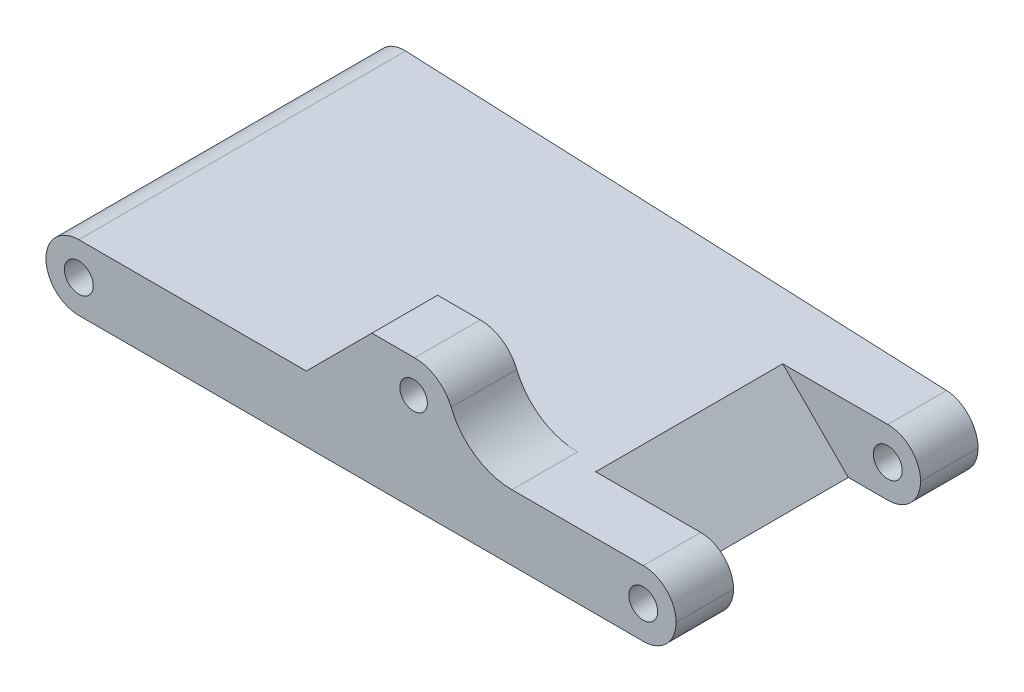
ISO-10303-21;
HEADER;
FILE_DESCRIPTION(('STEP AP214'),'2;1');
FILE_NAME('part.step','',(''),(''),'','','');
FILE_SCHEMA(('AUTOMOTIVE_DESIGN { 1 0 10303 214 1 1 1 1 }'));
ENDSEC;
DATA;
#1=APPLICATION_CONTEXT('core data for automotive mechanical design processes');
#2=APPLICATION_PROTOCOL_DEFINITION('international standard','automotive_design',2000,#1);
#3=PRODUCT_CONTEXT('',#1,'mechanical');
#4=PRODUCT('Part','Part','',(#3));
#5=PRODUCT_RELATED_PRODUCT_CATEGORY('part','',(#4));
#6=PRODUCT_DEFINITION_FORMATION('','',#4);
#7=PRODUCT_DEFINITION_CONTEXT('part definition',#1,'design');
#8=PRODUCT_DEFINITION('design','',#6,#7);
#9=PRODUCT_DEFINITION_SHAPE('','',#8);
#10=(LENGTH_UNIT() NAMED_UNIT(*) SI_UNIT(.MILLI.,.METRE.));
#11=(NAMED_UNIT(*) PLANE_ANGLE_UNIT() SI_UNIT($,.RADIAN.));
#12=(NAMED_UNIT(*) SI_UNIT($,.STERADIAN.) SOLID_ANGLE_UNIT());
#13=UNCERTAINTY_MEASURE_WITH_UNIT(LENGTH_MEASURE(1.E-05),#10,'distance_accuracy_value','');
#14=(GEOMETRIC_REPRESENTATION_CONTEXT(3) GLOBAL_UNCERTAINTY_ASSIGNED_CONTEXT((#13)) GLOBAL_UNIT_ASSIGNED_CONTEXT((#10,
#11,#12)) REPRESENTATION_CONTEXT('',''));
#15=CARTESIAN_POINT('',(0.,0.,0.));
#16=DIRECTION('',(0.,0.,1.));
#17=DIRECTION('',(1.,0.,0.));
#18=AXIS2_PLACEMENT_3D('',#15,#16,#17);
#19=CARTESIAN_POINT('',(17.8860294117647,2.5,-28.0084529624945));
#20=DIRECTION('',(0.,0.,1.));
#21=DIRECTION('',(1.,0.,0.));
#22=AXIS2_PLACEMENT_3D('',#19,#20,#21);
#23=CYLINDRICAL_SURFACE('',#22,1.1);
#24=CARTESIAN_POINT('',(17.8860294117647,2.5,0.));
#25=DIRECTION('',(0.,0.,1.));
#26=DIRECTION('',(1.,0.,0.));
#27=AXIS2_PLACEMENT_3D('',#24,#25,#26);
#28=CIRCLE('',#27,1.1);
#29=CARTESIAN_POINT('',(18.9860294117647,2.5,0.));
#30=VERTEX_POINT('',#29);
#31=EDGE_CURVE('E202',#30,#30,#28,.T.);
#32=ORIENTED_EDGE('',*,*,#31,.T.);
#33=EDGE_LOOP('',(#32));
#34=FACE_BOUND('',#33,.T.);
#35=CARTESIAN_POINT('',(17.8860294117647,2.5,-4.375));
#36=DIRECTION('',(0.,0.,-1.));
#37=DIRECTION('',(-1.,0.,0.));
#38=AXIS2_PLACEMENT_3D('',#35,#36,#37);
#39=CIRCLE('',#38,1.1);
#40=CARTESIAN_POINT('',(16.7860294117647,2.5,-4.375));
#41=VERTEX_POINT('',#40);
#42=EDGE_CURVE('E279',#41,#41,#39,.F.);
#43=ORIENTED_EDGE('',*,*,#42,.F.);
#44=EDGE_LOOP('',(#43));
#45=FACE_BOUND('',#44,.T.);
#46=ADVANCED_FACE('F33',(#34,#45),#23,.F.);
#47=CARTESIAN_POINT('',(17.8860294117647,2.5,0.));
#48=DIRECTION('',(0.,0.,-1.));
#49=DIRECTION('',(-1.,0.,0.));
#50=AXIS2_PLACEMENT_3D('',#47,#48,#49);
#51=CYLINDRICAL_SURFACE('',#50,2.5);
#52=DIRECTION('',(0.,0.,-1.));
#53=VECTOR('',#52,1.);
#54=CARTESIAN_POINT('',(20.3860294117647,2.5,0.));
#55=LINE('',#54,#53);
#56=CARTESIAN_POINT('',(20.3860294117647,2.5,-4.375));
#57=VERTEX_POINT('',#56);
#58=CARTESIAN_POINT('',(20.3860294117647,2.5,0.));
#59=VERTEX_POINT('',#58);
#60=EDGE_CURVE('E197',#57,#59,#55,.F.);
#61=ORIENTED_EDGE('',*,*,#60,.F.);
#62=CARTESIAN_POINT('',(17.8860294117647,2.5,-4.375));
#63=DIRECTION('',(0.,0.,-1.));
#64=DIRECTION('',(-1.,0.,0.));
#65=AXIS2_PLACEMENT_3D('',#62,#63,#64);
#66=CIRCLE('',#65,2.5);
#67=CARTESIAN_POINT('',(17.8860294117647,5.,-4.375));
#68=VERTEX_POINT('',#67);
#69=EDGE_CURVE('E282',#57,#68,#66,.F.);
#70=ORIENTED_EDGE('',*,*,#69,.T.);
#71=DIRECTION('',(0.,0.,-1.));
#72=VECTOR('',#71,1.);
#73=CARTESIAN_POINT('',(17.8860294117647,5.,0.));
#74=LINE('',#73,#72);
#75=CARTESIAN_POINT('',(17.8860294117647,5.,0.));
#76=VERTEX_POINT('',#75);
#77=EDGE_CURVE('E193',#76,#68,#74,.T.);
#78=ORIENTED_EDGE('',*,*,#77,.F.);
#79=CARTESIAN_POINT('',(17.8860294117647,2.5,0.));
#80=DIRECTION('',(0.,0.,-1.));
#81=DIRECTION('',(-1.,0.,0.));
#82=AXIS2_PLACEMENT_3D('',#79,#80,#81);
#83=CIRCLE('',#82,2.5);
#84=EDGE_CURVE('E211',#59,#76,#83,.F.);
#85=ORIENTED_EDGE('',*,*,#84,.F.);
#86=EDGE_LOOP('',(#61,#70,#78,#85));
#87=FACE_BOUND('',#86,.T.);
#88=ADVANCED_FACE('F299',(#87),#51,.T.);
#89=CARTESIAN_POINT('',(17.8860294117647,2.5,0.));
#90=DIRECTION('',(0.,0.,1.));
#91=DIRECTION('',(1.,0.,0.));
#92=AXIS2_PLACEMENT_3D('',#89,#90,#91);
#93=CYLINDRICAL_SURFACE('',#92,2.5);
#94=DIRECTION('',(0.,0.,-1.));
#95=VECTOR('',#94,1.);
#96=CARTESIAN_POINT('',(17.8860294117647,0.,0.));
#97=LINE('',#96,#95);
#98=CARTESIAN_POINT('',(17.8860294117647,0.,-4.375));
#99=VERTEX_POINT('',#98);
#100=CARTESIAN_POINT('',(17.8860294117647,0.,0.));
#101=VERTEX_POINT('',#100);
#102=EDGE_CURVE('E220',#99,#101,#97,.F.);
#103=ORIENTED_EDGE('',*,*,#102,.F.);
#104=CARTESIAN_POINT('',(17.8860294117647,2.5,-4.375));
#105=DIRECTION('',(0.,0.,-1.));
#106=DIRECTION('',(-1.,0.,0.));
#107=AXIS2_PLACEMENT_3D('',#104,#105,#106);
#108=CIRCLE('',#107,2.5);
#109=EDGE_CURVE('E154',#99,#57,#108,.F.);
#110=ORIENTED_EDGE('',*,*,#109,.T.);
#111=ORIENTED_EDGE('',*,*,#60,.T.);
#112=CARTESIAN_POINT('',(17.8860294117647,2.5,0.));
#113=DIRECTION('',(0.,0.,-1.));
#114=DIRECTION('',(-1.,0.,0.));
#115=AXIS2_PLACEMENT_3D('',#112,#113,#114);
#116=CIRCLE('',#115,2.5);
#117=EDGE_CURVE('E208',#101,#59,#116,.F.);
#118=ORIENTED_EDGE('',*,*,#117,.F.);
#119=EDGE_LOOP('',(#103,#110,#111,#118));
#120=FACE_BOUND('',#119,.T.);
#121=ADVANCED_FACE('F303',(#120),#93,.T.);
#122=CARTESIAN_POINT('',(0.,5.,0.));
#123=DIRECTION('',(0.,-1.,0.));
#124=DIRECTION('',(0.,0.,-1.));
#125=AXIS2_PLACEMENT_3D('',#122,#123,#124);
#126=PLANE('',#125);
#127=DIRECTION('',(0.,0.,-1.));
#128=VECTOR('',#127,1.);
#129=CARTESIAN_POINT('',(9.8860294117647,5.,-18.625));
#130=LINE('',#129,#128);
#131=CARTESIAN_POINT('',(9.8860294117647,5.,-4.375));
#132=VERTEX_POINT('',#131);
#133=CARTESIAN_POINT('',(9.8860294117647,5.,-18.625));
#134=VERTEX_POINT('',#133);
#135=EDGE_CURVE('E170',#132,#134,#130,.T.);
#136=ORIENTED_EDGE('',*,*,#135,.T.);
#137=DIRECTION('',(-1.,0.,0.));
#138=VECTOR('',#137,1.);
#139=CARTESIAN_POINT('',(20.3860294117647,5.,-18.625));
#140=LINE('',#139,#138);
#141=CARTESIAN_POINT('',(17.8860294117647,5.,-18.625));
#142=VERTEX_POINT('',#141);
#143=EDGE_CURVE('E166',#142,#134,#140,.T.);
#144=ORIENTED_EDGE('',*,*,#143,.F.);
#145=CARTESIAN_POINT('',(17.8860294117647,5.,-23.1041666666667));
#146=VERTEX_POINT('',#145);
#147=EDGE_CURVE('E205',#142,#146,#74,.T.);
#148=ORIENTED_EDGE('',*,*,#147,.T.);
#149=DIRECTION('',(-0.999133073092352,0.,-0.0416305447121814));
#150=VECTOR('',#149,1.);
#151=CARTESIAN_POINT('',(-27.6139705882353,5.,-25.));
#152=LINE('',#151,#150);
#153=CARTESIAN_POINT('',(-25.1139705882353,5.,-24.8958333333333));
#154=VERTEX_POINT('',#153);
#155=EDGE_CURVE('E232',#146,#154,#152,.T.);
#156=ORIENTED_EDGE('',*,*,#155,.T.);
#157=DIRECTION('',(0.,0.,1.));
#158=VECTOR('',#157,1.);
#159=CARTESIAN_POINT('',(-25.1139705882353,5.,0.));
#160=LINE('',#159,#158);
#161=CARTESIAN_POINT('',(-25.1139705882353,5.,0.));
#162=VERTEX_POINT('',#161);
#163=EDGE_CURVE('E206',#154,#162,#160,.T.);
#164=ORIENTED_EDGE('',*,*,#163,.T.);
#165=DIRECTION('',(1.,0.,0.));
#166=VECTOR('',#165,1.);
#167=CARTESIAN_POINT('',(-27.6139705882353,5.,0.));
#168=LINE('',#167,#166);
#169=CARTESIAN_POINT('',(-7.78503840010077,5.,0.));
#170=VERTEX_POINT('',#169);
#171=EDGE_CURVE('E243',#162,#170,#168,.T.);
#172=ORIENTED_EDGE('',*,*,#171,.T.);
#173=DIRECTION('',(0.,0.,1.));
#174=VECTOR('',#173,1.);
#175=CARTESIAN_POINT('',(-7.78503840010077,5.,-5.));
#176=LINE('',#175,#174);
#177=CARTESIAN_POINT('',(-7.78503840010077,5.,-5.));
#178=VERTEX_POINT('',#177);
#179=EDGE_CURVE('E198',#178,#170,#176,.T.);
#180=ORIENTED_EDGE('',*,*,#179,.F.);
#181=DIRECTION('',(-1.,0.,0.));
#182=VECTOR('',#181,1.);
#183=CARTESIAN_POINT('',(0.,5.,-5.));
#184=LINE('',#183,#182);
#185=CARTESIAN_POINT('',(7.88602941176469,5.,-5.));
#186=VERTEX_POINT('',#185);
#187=EDGE_CURVE('E190',#186,#178,#184,.T.);
#188=ORIENTED_EDGE('',*,*,#187,.F.);
#189=DIRECTION('',(0.,0.,1.));
#190=VECTOR('',#189,1.);
#191=CARTESIAN_POINT('',(7.88602941176469,5.,0.));
#192=LINE('',#191,#190);
#193=CARTESIAN_POINT('',(7.8860294117647,5.,0.));
#194=VERTEX_POINT('',#193);
#195=EDGE_CURVE('E187',#186,#194,#192,.T.);
#196=ORIENTED_EDGE('',*,*,#195,.T.);
#197=EDGE_CURVE('E236',#194,#76,#168,.T.);
#198=ORIENTED_EDGE('',*,*,#197,.T.);
#199=ORIENTED_EDGE('',*,*,#77,.T.);
#200=DIRECTION('',(-1.,0.,0.));
#201=VECTOR('',#200,1.);
#202=CARTESIAN_POINT('',(20.3860294117647,5.,-4.375));
#203=LINE('',#202,#201);
#204=EDGE_CURVE('E285',#68,#132,#203,.T.);
#205=ORIENTED_EDGE('',*,*,#204,.T.);
#206=EDGE_LOOP('',(#136,#144,#148,#156,#164,#172,#180,#188,#196,#198,#199,#205));
#207=FACE_BOUND('',#206,.T.);
#208=ADVANCED_FACE('F295',(#207),#126,.F.);
#209=CARTESIAN_POINT('',(-27.6139705882353,5.,0.));
#210=DIRECTION('',(0.,0.,-1.));
#211=DIRECTION('',(-1.,0.,0.));
#212=AXIS2_PLACEMENT_3D('',#209,#210,#211);
#213=PLANE('',#212);
#214=CARTESIAN_POINT('',(0.386029411764694,7.49237514423129,0.));
#215=DIRECTION('',(0.,0.,1.));
#216=DIRECTION('',(1.,0.,0.));
#217=AXIS2_PLACEMENT_3D('',#214,#215,#216);
#218=CIRCLE('',#217,1.05);
#219=CARTESIAN_POINT('',(1.43602941176469,7.49237514423129,0.));
#220=VERTEX_POINT('',#219);
#221=EDGE_CURVE('E271',#220,#220,#218,.T.);
#222=ORIENTED_EDGE('',*,*,#221,.F.);
#223=EDGE_LOOP('',(#222));
#224=FACE_BOUND('',#223,.T.);
#225=CARTESIAN_POINT('',(7.88602941176469,10.,0.));
#226=DIRECTION('',(0.,0.,-1.));
#227=DIRECTION('',(-1.,0.,0.));
#228=AXIS2_PLACEMENT_3D('',#225,#226,#227);
#229=CIRCLE('',#228,5.);
#230=CARTESIAN_POINT('',(3.25090535732991,8.125,0.));
#231=VERTEX_POINT('',#230);
#232=EDGE_CURVE('E185',#194,#231,#229,.T.);
#233=ORIENTED_EDGE('',*,*,#232,.T.);
#234=CARTESIAN_POINT('',(0.469830924669032,7.,0.));
#235=DIRECTION('',(0.,0.,-1.));
#236=DIRECTION('',(-1.,0.,0.));
#237=AXIS2_PLACEMENT_3D('',#234,#235,#236);
#238=CIRCLE('',#237,3.);
#239=CARTESIAN_POINT('',(0.469830924669032,10.,0.));
#240=VERTEX_POINT('',#239);
#241=EDGE_CURVE('E55',#231,#240,#238,.F.);
#242=ORIENTED_EDGE('',*,*,#241,.T.);
#243=DIRECTION('',(1.,0.,0.));
#244=VECTOR('',#243,1.);
#245=CARTESIAN_POINT('',(-2.78503840010079,10.,0.));
#246=LINE('',#245,#244);
#247=CARTESIAN_POINT('',(-2.78503840010079,10.,0.));
#248=VERTEX_POINT('',#247);
#249=EDGE_CURVE('E264',#248,#240,#246,.T.);
#250=ORIENTED_EDGE('',*,*,#249,.F.);
#251=DIRECTION('',(0.707106781186546,0.707106781186549,0.));
#252=VECTOR('',#251,1.);
#253=CARTESIAN_POINT('',(-7.78503840010077,5.,0.));
#254=LINE('',#253,#252);
#255=EDGE_CURVE('E261',#170,#248,#254,.T.);
#256=ORIENTED_EDGE('',*,*,#255,.F.);
#257=ORIENTED_EDGE('',*,*,#171,.F.);
#258=CARTESIAN_POINT('',(-25.1139705882353,2.5,0.));
#259=DIRECTION('',(0.,0.,-1.));
#260=DIRECTION('',(-1.,0.,0.));
#261=AXIS2_PLACEMENT_3D('',#258,#259,#260);
#262=CIRCLE('',#261,2.5);
#263=CARTESIAN_POINT('',(-27.6139705882353,2.5,0.));
#264=VERTEX_POINT('',#263);
#265=EDGE_CURVE('E216',#162,#264,#262,.F.);
#266=ORIENTED_EDGE('',*,*,#265,.T.);
#267=CARTESIAN_POINT('',(-25.1139705882353,2.5,0.));
#268=DIRECTION('',(0.,0.,-1.));
#269=DIRECTION('',(-1.,0.,0.));
#270=AXIS2_PLACEMENT_3D('',#267,#268,#269);
#271=CIRCLE('',#270,2.5);
#272=CARTESIAN_POINT('',(-25.1139705882353,0.,0.));
#273=VERTEX_POINT('',#272);
#274=EDGE_CURVE('E214',#264,#273,#271,.F.);
#275=ORIENTED_EDGE('',*,*,#274,.T.);
#276=DIRECTION('',(1.,0.,0.));
#277=VECTOR('',#276,1.);
#278=CARTESIAN_POINT('',(-27.6139705882353,0.,0.));
#279=LINE('',#278,#277);
#280=EDGE_CURVE('E237',#273,#101,#279,.T.);
#281=ORIENTED_EDGE('',*,*,#280,.T.);
#282=ORIENTED_EDGE('',*,*,#117,.T.);
#283=ORIENTED_EDGE('',*,*,#84,.T.);
#284=ORIENTED_EDGE('',*,*,#197,.F.);
#285=EDGE_LOOP('',(#233,#242,#250,#256,#257,#266,#275,#281,#282,#283,#284));
#286=FACE_BOUND('',#285,.T.);
#287=ORIENTED_EDGE('',*,*,#31,.F.);
#288=EDGE_LOOP('',(#287));
#289=FACE_BOUND('',#288,.T.);
#290=CARTESIAN_POINT('',(-25.1139705882353,2.5,0.));
#291=DIRECTION('',(0.,0.,1.));
#292=DIRECTION('',(1.,0.,0.));
#293=AXIS2_PLACEMENT_3D('',#290,#291,#292);
#294=CIRCLE('',#293,1.1);
#295=CARTESIAN_POINT('',(-24.0139705882353,2.5,0.));
#296=VERTEX_POINT('',#295);
#297=EDGE_CURVE('E247',#296,#296,#294,.T.);
#298=ORIENTED_EDGE('',*,*,#297,.F.);
#299=EDGE_LOOP('',(#298));
#300=FACE_BOUND('',#299,.T.);
#301=ADVANCED_FACE('F304',(#224,#286,#289,#300),#213,.F.);
#302=CARTESIAN_POINT('',(-27.6139705882353,5.,-25.));
#303=DIRECTION('',(-0.0416305447121814,0.,0.999133073092352));
#304=DIRECTION('',(0.999133073092352,0.,0.0416305447121814));
#305=AXIS2_PLACEMENT_3D('',#302,#303,#304);
#306=PLANE('',#305);
#307=CARTESIAN_POINT('',(17.8860294117647,2.5,-23.1041666666667));
#308=DIRECTION('',(-0.0416305447121814,0.,0.999133073092352));
#309=DIRECTION('',(0.999133073092352,0.,0.0416305447121814));
#310=AXIS2_PLACEMENT_3D('',#307,#308,#309);
#311=ELLIPSE('',#310,1.10095444703423,1.1);
#312=CARTESIAN_POINT('',(18.9860294117647,2.5,-23.0583333333333));
#313=VERTEX_POINT('',#312);
#314=EDGE_CURVE('E250',#313,#313,#311,.F.);
#315=ORIENTED_EDGE('',*,*,#314,.F.);
#316=EDGE_LOOP('',(#315));
#317=FACE_BOUND('',#316,.T.);
#318=CARTESIAN_POINT('',(-25.1139705882353,2.5,-24.8958333333333));
#319=DIRECTION('',(-0.0416305447121814,0.,0.999133073092352));
#320=DIRECTION('',(0.999133073092352,0.,0.0416305447121814));
#321=AXIS2_PLACEMENT_3D('',#318,#319,#320);
#322=ELLIPSE('',#321,1.10095444703423,1.1);
#323=CARTESIAN_POINT('',(-24.0139705882353,2.5,-24.85));
#324=VERTEX_POINT('',#323);
#325=EDGE_CURVE('E240',#324,#324,#322,.F.);
#326=ORIENTED_EDGE('',*,*,#325,.F.);
#327=EDGE_LOOP('',(#326));
#328=FACE_BOUND('',#327,.T.);
#329=CARTESIAN_POINT('',(17.8860294117647,2.5,-23.1041666666667));
#330=DIRECTION('',(-0.0416305447121814,0.,0.999133073092352));
#331=DIRECTION('',(-0.999133073092352,0.,-0.0416305447121814));
#332=AXIS2_PLACEMENT_3D('',#329,#330,#331);
#333=ELLIPSE('',#332,2.50216919780507,2.5);
#334=CARTESIAN_POINT('',(20.3860294117647,2.5,-23.));
#335=VERTEX_POINT('',#334);
#336=EDGE_CURVE('E226',#146,#335,#333,.F.);
#337=ORIENTED_EDGE('',*,*,#336,.T.);
#338=CARTESIAN_POINT('',(17.8860294117647,2.5,-23.1041666666667));
#339=DIRECTION('',(-0.0416305447121814,0.,0.999133073092352));
#340=DIRECTION('',(0.999133073092352,0.,0.0416305447121814));
#341=AXIS2_PLACEMENT_3D('',#338,#339,#340);
#342=ELLIPSE('',#341,2.50216919780507,2.5);
#343=CARTESIAN_POINT('',(17.8860294117647,0.,-23.1041666666667));
#344=VERTEX_POINT('',#343);
#345=EDGE_CURVE('E224',#335,#344,#342,.F.);
#346=ORIENTED_EDGE('',*,*,#345,.T.);
#347=DIRECTION('',(-0.999133073092352,0.,-0.0416305447121814));
#348=VECTOR('',#347,1.);
#349=CARTESIAN_POINT('',(-27.6139705882353,0.,-25.));
#350=LINE('',#349,#348);
#351=CARTESIAN_POINT('',(-25.1139705882353,0.,-24.8958333333333));
#352=VERTEX_POINT('',#351);
#353=EDGE_CURVE('E233',#344,#352,#350,.T.);
#354=ORIENTED_EDGE('',*,*,#353,.T.);
#355=CARTESIAN_POINT('',(-25.1139705882353,2.5,-24.8958333333333));
#356=DIRECTION('',(-0.0416305447121814,0.,0.999133073092352));
#357=DIRECTION('',(-0.999133073092352,0.,-0.0416305447121814));
#358=AXIS2_PLACEMENT_3D('',#355,#356,#357);
#359=ELLIPSE('',#358,2.50216919780507,2.5);
#360=CARTESIAN_POINT('',(-27.6139705882353,2.5,-25.));
#361=VERTEX_POINT('',#360);
#362=EDGE_CURVE('E228',#352,#361,#359,.F.);
#363=ORIENTED_EDGE('',*,*,#362,.T.);
#364=CARTESIAN_POINT('',(-25.1139705882353,2.5,-24.8958333333333));
#365=DIRECTION('',(-0.0416305447121814,0.,0.999133073092352));
#366=DIRECTION('',(0.999133073092352,0.,0.0416305447121814));
#367=AXIS2_PLACEMENT_3D('',#364,#365,#366);
#368=ELLIPSE('',#367,2.50216919780507,2.5);
#369=EDGE_CURVE('E230',#361,#154,#368,.F.);
#370=ORIENTED_EDGE('',*,*,#369,.T.);
#371=ORIENTED_EDGE('',*,*,#155,.F.);
#372=EDGE_LOOP('',(#337,#346,#354,#363,#370,#371));
#373=FACE_BOUND('',#372,.T.);
#374=ADVANCED_FACE('F316',(#317,#328,#373),#306,.F.);
#375=CARTESIAN_POINT('',(0.,0.,0.));
#376=DIRECTION('',(0.,-1.,0.));
#377=DIRECTION('',(0.,0.,-1.));
#378=AXIS2_PLACEMENT_3D('',#375,#376,#377);
#379=PLANE('',#378);
#380=DIRECTION('',(-1.,0.,0.));
#381=VECTOR('',#380,1.);
#382=CARTESIAN_POINT('',(20.3860294117647,0.,-18.625));
#383=LINE('',#382,#381);
#384=CARTESIAN_POINT('',(17.8860294117647,0.,-18.625));
#385=VERTEX_POINT('',#384);
#386=CARTESIAN_POINT('',(14.8860294117647,0.,-18.625));
#387=VERTEX_POINT('',#386);
#388=EDGE_CURVE('E163',#385,#387,#383,.T.);
#389=ORIENTED_EDGE('',*,*,#388,.T.);
#390=DIRECTION('',(0.,0.,-1.));
#391=VECTOR('',#390,1.);
#392=CARTESIAN_POINT('',(14.8860294117647,0.,-4.375));
#393=LINE('',#392,#391);
#394=CARTESIAN_POINT('',(14.8860294117647,0.,-4.375));
#395=VERTEX_POINT('',#394);
#396=EDGE_CURVE('E157',#395,#387,#393,.T.);
#397=ORIENTED_EDGE('',*,*,#396,.F.);
#398=DIRECTION('',(-1.,0.,0.));
#399=VECTOR('',#398,1.);
#400=CARTESIAN_POINT('',(20.3860294117647,0.,-4.375));
#401=LINE('',#400,#399);
#402=EDGE_CURVE('E146',#99,#395,#401,.T.);
#403=ORIENTED_EDGE('',*,*,#402,.F.);
#404=ORIENTED_EDGE('',*,*,#102,.T.);
#405=ORIENTED_EDGE('',*,*,#280,.F.);
#406=DIRECTION('',(0.,0.,1.));
#407=VECTOR('',#406,1.);
#408=CARTESIAN_POINT('',(-25.1139705882353,0.,-25.));
#409=LINE('',#408,#407);
#410=EDGE_CURVE('E221',#273,#352,#409,.F.);
#411=ORIENTED_EDGE('',*,*,#410,.T.);
#412=ORIENTED_EDGE('',*,*,#353,.F.);
#413=EDGE_CURVE('E218',#344,#385,#97,.F.);
#414=ORIENTED_EDGE('',*,*,#413,.T.);
#415=EDGE_LOOP('',(#389,#397,#403,#404,#405,#411,#412,#414));
#416=FACE_BOUND('',#415,.T.);
#417=ADVANCED_FACE('F161',(#416),#379,.T.);
#418=CARTESIAN_POINT('',(-25.1139705882353,2.5,-28.0084529624945));
#419=DIRECTION('',(0.,0.,1.));
#420=DIRECTION('',(1.,0.,0.));
#421=AXIS2_PLACEMENT_3D('',#418,#419,#420);
#422=CYLINDRICAL_SURFACE('',#421,1.1);
#423=ORIENTED_EDGE('',*,*,#325,.T.);
#424=EDGE_LOOP('',(#423));
#425=FACE_BOUND('',#424,.T.);
#426=ORIENTED_EDGE('',*,*,#297,.T.);
#427=EDGE_LOOP('',(#426));
#428=FACE_BOUND('',#427,.T.);
#429=ADVANCED_FACE('F363',(#425,#428),#422,.F.);
#430=CARTESIAN_POINT('',(17.8860294117647,2.5,-18.625));
#431=DIRECTION('',(0.,0.,-1.));
#432=DIRECTION('',(-1.,0.,0.));
#433=AXIS2_PLACEMENT_3D('',#430,#431,#432);
#434=CIRCLE('',#433,1.1);
#435=CARTESIAN_POINT('',(16.7860294117647,2.5,-18.625));
#436=VERTEX_POINT('',#435);
#437=EDGE_CURVE('E274',#436,#436,#434,.F.);
#438=ORIENTED_EDGE('',*,*,#437,.T.);
#439=EDGE_LOOP('',(#438));
#440=FACE_BOUND('',#439,.T.);
#441=ORIENTED_EDGE('',*,*,#314,.T.);
#442=EDGE_LOOP('',(#441));
#443=FACE_BOUND('',#442,.T.);
#444=ADVANCED_FACE('F353',(#440,#443),#23,.F.);
#445=CARTESIAN_POINT('',(17.8860294117647,2.5,-18.625));
#446=DIRECTION('',(0.,0.,-1.));
#447=DIRECTION('',(-1.,0.,0.));
#448=AXIS2_PLACEMENT_3D('',#445,#446,#447);
#449=CIRCLE('',#448,2.5);
#450=CARTESIAN_POINT('',(20.3860294117647,2.5,-18.625));
#451=VERTEX_POINT('',#450);
#452=EDGE_CURVE('E277',#451,#142,#449,.F.);
#453=ORIENTED_EDGE('',*,*,#452,.F.);
#454=EDGE_CURVE('E199',#335,#451,#55,.F.);
#455=ORIENTED_EDGE('',*,*,#454,.F.);
#456=ORIENTED_EDGE('',*,*,#336,.F.);
#457=ORIENTED_EDGE('',*,*,#147,.F.);
#458=EDGE_LOOP('',(#453,#455,#456,#457));
#459=FACE_BOUND('',#458,.T.);
#460=ADVANCED_FACE('F358',(#459),#51,.T.);
#461=CARTESIAN_POINT('',(17.8860294117647,2.5,-18.625));
#462=DIRECTION('',(0.,0.,-1.));
#463=DIRECTION('',(-1.,0.,0.));
#464=AXIS2_PLACEMENT_3D('',#461,#462,#463);
#465=CIRCLE('',#464,2.5);
#466=EDGE_CURVE('E180',#385,#451,#465,.F.);
#467=ORIENTED_EDGE('',*,*,#466,.F.);
#468=ORIENTED_EDGE('',*,*,#413,.F.);
#469=ORIENTED_EDGE('',*,*,#345,.F.);
#470=ORIENTED_EDGE('',*,*,#454,.T.);
#471=EDGE_LOOP('',(#467,#468,#469,#470));
#472=FACE_BOUND('',#471,.T.);
#473=ADVANCED_FACE('F369',(#472),#93,.T.);
#474=CARTESIAN_POINT('',(-25.1139705882353,2.5,0.));
#475=DIRECTION('',(0.,0.,1.));
#476=DIRECTION('',(1.,0.,0.));
#477=AXIS2_PLACEMENT_3D('',#474,#475,#476);
#478=CYLINDRICAL_SURFACE('',#477,2.5);
#479=ORIENTED_EDGE('',*,*,#163,.F.);
#480=ORIENTED_EDGE('',*,*,#369,.F.);
#481=DIRECTION('',(0.,0.,1.));
#482=VECTOR('',#481,1.);
#483=CARTESIAN_POINT('',(-27.6139705882353,2.5,0.));
#484=LINE('',#483,#482);
#485=EDGE_CURVE('E194',#264,#361,#484,.F.);
#486=ORIENTED_EDGE('',*,*,#485,.F.);
#487=ORIENTED_EDGE('',*,*,#265,.F.);
#488=EDGE_LOOP('',(#479,#480,#486,#487));
#489=FACE_BOUND('',#488,.T.);
#490=ADVANCED_FACE('F320',(#489),#478,.T.);
#491=CARTESIAN_POINT('',(-25.1139705882353,2.5,0.));
#492=DIRECTION('',(0.,0.,-1.));
#493=DIRECTION('',(-1.,0.,0.));
#494=AXIS2_PLACEMENT_3D('',#491,#492,#493);
#495=CYLINDRICAL_SURFACE('',#494,2.5);
#496=ORIENTED_EDGE('',*,*,#362,.F.);
#497=ORIENTED_EDGE('',*,*,#410,.F.);
#498=ORIENTED_EDGE('',*,*,#274,.F.);
#499=ORIENTED_EDGE('',*,*,#485,.T.);
#500=EDGE_LOOP('',(#496,#497,#498,#499));
#501=FACE_BOUND('',#500,.T.);
#502=ADVANCED_FACE('F312',(#501),#495,.T.);
#503=CARTESIAN_POINT('',(0.,0.,-5.));
#504=DIRECTION('',(0.,0.,1.));
#505=DIRECTION('',(1.,0.,0.));
#506=AXIS2_PLACEMENT_3D('',#503,#504,#505);
#507=PLANE('',#506);
#508=CARTESIAN_POINT('',(0.386029411764694,7.49237514423129,-5.));
#509=DIRECTION('',(0.,0.,1.));
#510=DIRECTION('',(1.,0.,0.));
#511=AXIS2_PLACEMENT_3D('',#508,#509,#510);
#512=CIRCLE('',#511,1.05);
#513=CARTESIAN_POINT('',(1.43602941176469,7.49237514423129,-5.));
#514=VERTEX_POINT('',#513);
#515=EDGE_CURVE('E266',#514,#514,#512,.F.);
#516=ORIENTED_EDGE('',*,*,#515,.F.);
#517=EDGE_LOOP('',(#516));
#518=FACE_BOUND('',#517,.T.);
#519=DIRECTION('',(1.,0.,0.));
#520=VECTOR('',#519,1.);
#521=CARTESIAN_POINT('',(-2.78503840010079,10.,-5.));
#522=LINE('',#521,#520);
#523=CARTESIAN_POINT('',(-2.78503840010079,10.,-5.));
#524=VERTEX_POINT('',#523);
#525=CARTESIAN_POINT('',(0.469830924669032,10.,-5.));
#526=VERTEX_POINT('',#525);
#527=EDGE_CURVE('E263',#524,#526,#522,.T.);
#528=ORIENTED_EDGE('',*,*,#527,.T.);
#529=CARTESIAN_POINT('',(0.469830924669032,7.,-5.));
#530=DIRECTION('',(0.,0.,1.));
#531=DIRECTION('',(1.,0.,0.));
#532=AXIS2_PLACEMENT_3D('',#529,#530,#531);
#533=CIRCLE('',#532,3.);
#534=CARTESIAN_POINT('',(3.25090535732991,8.125,-5.));
#535=VERTEX_POINT('',#534);
#536=EDGE_CURVE('E11',#526,#535,#533,.F.);
#537=ORIENTED_EDGE('',*,*,#536,.T.);
#538=CARTESIAN_POINT('',(7.88602941176469,10.,-5.));
#539=DIRECTION('',(0.,0.,1.));
#540=DIRECTION('',(1.,0.,0.));
#541=AXIS2_PLACEMENT_3D('',#538,#539,#540);
#542=CIRCLE('',#541,5.);
#543=EDGE_CURVE('E183',#535,#186,#542,.T.);
#544=ORIENTED_EDGE('',*,*,#543,.T.);
#545=ORIENTED_EDGE('',*,*,#187,.T.);
#546=DIRECTION('',(0.707106781186546,0.707106781186549,0.));
#547=VECTOR('',#546,1.);
#548=CARTESIAN_POINT('',(-7.78503840010077,5.,-5.));
#549=LINE('',#548,#547);
#550=EDGE_CURVE('E258',#178,#524,#549,.T.);
#551=ORIENTED_EDGE('',*,*,#550,.T.);
#552=EDGE_LOOP('',(#528,#537,#544,#545,#551));
#553=FACE_BOUND('',#552,.T.);
#554=ADVANCED_FACE('F331',(#518,#553),#507,.F.);
#555=CARTESIAN_POINT('',(-7.78503840010077,5.,-5.));
#556=DIRECTION('',(0.707106781186549,-0.707106781186546,0.));
#557=DIRECTION('',(0.707106781186546,0.707106781186549,0.));
#558=AXIS2_PLACEMENT_3D('',#555,#556,#557);
#559=PLANE('',#558);
#560=ORIENTED_EDGE('',*,*,#255,.T.);
#561=DIRECTION('',(0.,0.,1.));
#562=VECTOR('',#561,1.);
#563=CARTESIAN_POINT('',(-2.78503840010079,10.,-5.));
#564=LINE('',#563,#562);
#565=EDGE_CURVE('E255',#524,#248,#564,.T.);
#566=ORIENTED_EDGE('',*,*,#565,.F.);
#567=ORIENTED_EDGE('',*,*,#550,.F.);
#568=ORIENTED_EDGE('',*,*,#179,.T.);
#569=EDGE_LOOP('',(#560,#566,#567,#568));
#570=FACE_BOUND('',#569,.T.);
#571=ADVANCED_FACE('F326',(#570),#559,.F.);
#572=CARTESIAN_POINT('',(-2.78503840010079,10.,-5.));
#573=DIRECTION('',(0.,-1.,0.));
#574=DIRECTION('',(0.,0.,-1.));
#575=AXIS2_PLACEMENT_3D('',#572,#573,#574);
#576=PLANE('',#575);
#577=ORIENTED_EDGE('',*,*,#249,.T.);
#578=DIRECTION('',(0.,0.,-1.));
#579=VECTOR('',#578,1.);
#580=CARTESIAN_POINT('',(0.469830924669032,10.,-5.));
#581=LINE('',#580,#579);
#582=EDGE_CURVE('E41',#240,#526,#581,.T.);
#583=ORIENTED_EDGE('',*,*,#582,.T.);
#584=ORIENTED_EDGE('',*,*,#527,.F.);
#585=ORIENTED_EDGE('',*,*,#565,.T.);
#586=EDGE_LOOP('',(#577,#583,#584,#585));
#587=FACE_BOUND('',#586,.T.);
#588=ADVANCED_FACE('F328',(#587),#576,.F.);
#589=CARTESIAN_POINT('',(0.386029411764694,7.49237514423129,-7.9698484809835));
#590=DIRECTION('',(0.,0.,1.));
#591=DIRECTION('',(1.,0.,0.));
#592=AXIS2_PLACEMENT_3D('',#589,#590,#591);
#593=CYLINDRICAL_SURFACE('',#592,1.05);
#594=ORIENTED_EDGE('',*,*,#515,.T.);
#595=EDGE_LOOP('',(#594));
#596=FACE_BOUND('',#595,.T.);
#597=ORIENTED_EDGE('',*,*,#221,.T.);
#598=EDGE_LOOP('',(#597));
#599=FACE_BOUND('',#598,.T.);
#600=ADVANCED_FACE('F340',(#596,#599),#593,.F.);
#601=CARTESIAN_POINT('',(7.88602941176469,10.,0.));
#602=DIRECTION('',(0.,0.,-1.));
#603=DIRECTION('',(-1.,0.,0.));
#604=AXIS2_PLACEMENT_3D('',#601,#602,#603);
#605=CYLINDRICAL_SURFACE('',#604,5.);
#606=ORIENTED_EDGE('',*,*,#543,.F.);
#607=DIRECTION('',(0.,0.,-1.));
#608=VECTOR('',#607,1.);
#609=CARTESIAN_POINT('',(3.25090535732991,8.125,0.));
#610=LINE('',#609,#608);
#611=EDGE_CURVE('E171',#535,#231,#610,.F.);
#612=ORIENTED_EDGE('',*,*,#611,.T.);
#613=ORIENTED_EDGE('',*,*,#232,.F.);
#614=ORIENTED_EDGE('',*,*,#195,.F.);
#615=EDGE_LOOP('',(#606,#612,#613,#614));
#616=FACE_BOUND('',#615,.T.);
#617=ADVANCED_FACE('F336',(#616),#605,.F.);
#618=CARTESIAN_POINT('',(20.3860294117647,-15.2745703703901,-18.625));
#619=DIRECTION('',(0.,0.,-1.));
#620=DIRECTION('',(-1.,0.,0.));
#621=AXIS2_PLACEMENT_3D('',#618,#619,#620);
#622=PLANE('',#621);
#623=ORIENTED_EDGE('',*,*,#452,.T.);
#624=ORIENTED_EDGE('',*,*,#143,.T.);
#625=DIRECTION('',(0.707106781186546,-0.707106781186549,0.));
#626=VECTOR('',#625,1.);
#627=CARTESIAN_POINT('',(25.2733145969597,-10.3872851851951,-18.625));
#628=LINE('',#627,#626);
#629=EDGE_CURVE('E172',#134,#387,#628,.T.);
#630=ORIENTED_EDGE('',*,*,#629,.T.);
#631=ORIENTED_EDGE('',*,*,#388,.F.);
#632=ORIENTED_EDGE('',*,*,#466,.T.);
#633=EDGE_LOOP('',(#623,#624,#630,#631,#632));
#634=FACE_BOUND('',#633,.T.);
#635=ORIENTED_EDGE('',*,*,#437,.F.);
#636=EDGE_LOOP('',(#635));
#637=FACE_BOUND('',#636,.T.);
#638=ADVANCED_FACE('F290',(#634,#637),#622,.F.);
#639=CARTESIAN_POINT('',(20.3860294117647,-15.2745703703901,-4.375));
#640=DIRECTION('',(0.,0.,-1.));
#641=DIRECTION('',(-1.,0.,0.));
#642=AXIS2_PLACEMENT_3D('',#639,#640,#641);
#643=PLANE('',#642);
#644=ORIENTED_EDGE('',*,*,#109,.F.);
#645=ORIENTED_EDGE('',*,*,#402,.T.);
#646=DIRECTION('',(-0.707106781186546,0.707106781186549,0.));
#647=VECTOR('',#646,1.);
#648=CARTESIAN_POINT('',(9.8860294117647,5.,-4.375));
#649=LINE('',#648,#647);
#650=EDGE_CURVE('E151',#395,#132,#649,.T.);
#651=ORIENTED_EDGE('',*,*,#650,.T.);
#652=ORIENTED_EDGE('',*,*,#204,.F.);
#653=ORIENTED_EDGE('',*,*,#69,.F.);
#654=EDGE_LOOP('',(#644,#645,#651,#652,#653));
#655=FACE_BOUND('',#654,.T.);
#656=ORIENTED_EDGE('',*,*,#42,.T.);
#657=EDGE_LOOP('',(#656));
#658=FACE_BOUND('',#657,.T.);
#659=ADVANCED_FACE('F148',(#655,#658),#643,.T.);
#660=CARTESIAN_POINT('',(9.8860294117647,5.,0.));
#661=DIRECTION('',(0.707106781186549,0.707106781186546,0.));
#662=DIRECTION('',(0.,0.,1.));
#663=AXIS2_PLACEMENT_3D('',#660,#661,#662);
#664=PLANE('',#663);
#665=ORIENTED_EDGE('',*,*,#650,.F.);
#666=ORIENTED_EDGE('',*,*,#396,.T.);
#667=ORIENTED_EDGE('',*,*,#629,.F.);
#668=ORIENTED_EDGE('',*,*,#135,.F.);
#669=EDGE_LOOP('',(#665,#666,#667,#668));
#670=FACE_BOUND('',#669,.T.);
#671=ADVANCED_FACE('F168',(#670),#664,.T.);
#672=CARTESIAN_POINT('',(0.469830924669032,7.,0.));
#673=DIRECTION('',(0.,0.,-1.));
#674=DIRECTION('',(-1.,0.,0.));
#675=AXIS2_PLACEMENT_3D('',#672,#673,#674);
#676=CYLINDRICAL_SURFACE('',#675,3.);
#677=ORIENTED_EDGE('',*,*,#536,.F.);
#678=ORIENTED_EDGE('',*,*,#582,.F.);
#679=ORIENTED_EDGE('',*,*,#241,.F.);
#680=ORIENTED_EDGE('',*,*,#611,.F.);
#681=EDGE_LOOP('',(#677,#678,#679,#680));
#682=FACE_BOUND('',#681,.T.);
#683=ADVANCED_FACE('F35',(#682),#676,.T.);
#684=CLOSED_SHELL('',(#46,#88,#121,#208,#301,#374,#417,#429,#444,#460,#473,#490,#502,#554,#571,
#588,#600,#617,#638,#659,#671,#683));
#685=MANIFOLD_SOLID_BREP('B2',#684);
#686=ADVANCED_BREP_SHAPE_REPRESENTATION('',(#18,#685),#14);
#687=SHAPE_DEFINITION_REPRESENTATION(#9,#686);
ENDSEC;
END-ISO-10303-21;
